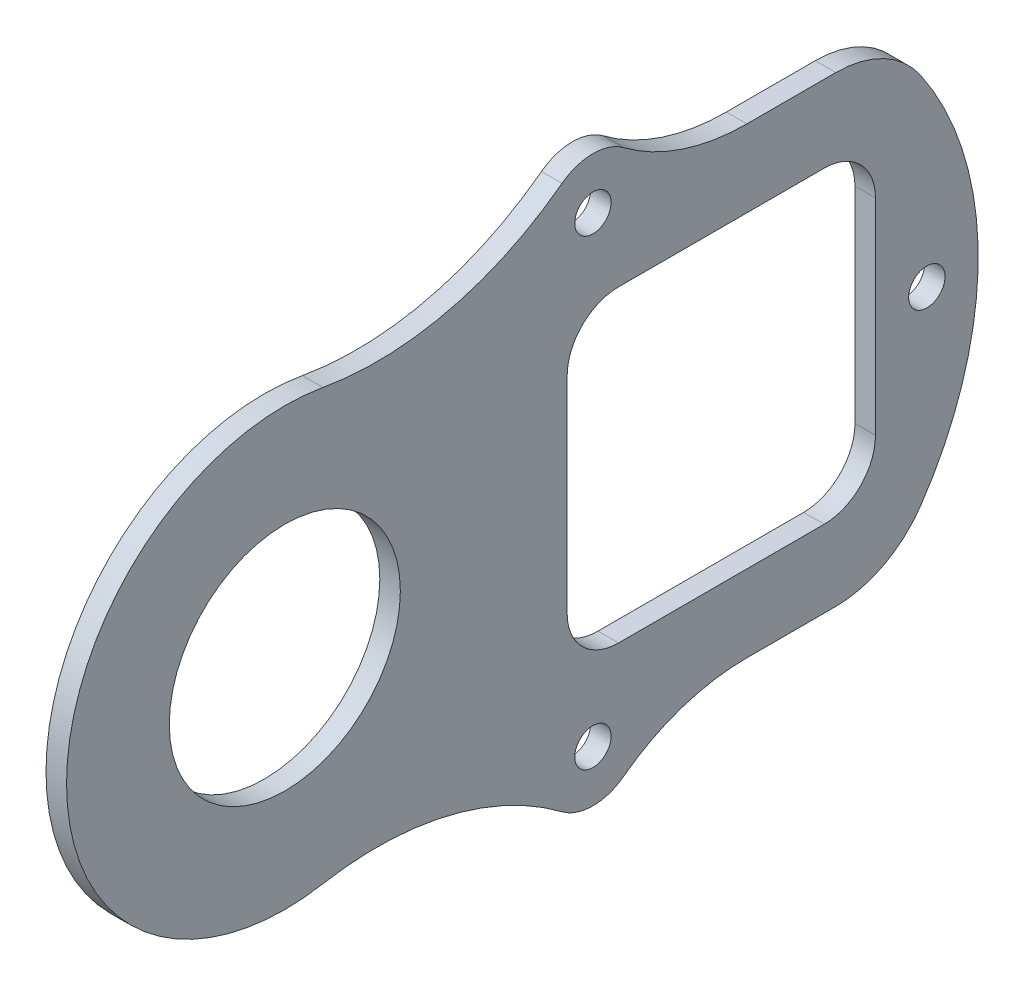
ISO-10303-21;
HEADER;
FILE_DESCRIPTION(('STEP AP214'),'2;1');
FILE_NAME('part.step','',(''),(''),'','','');
FILE_SCHEMA(('AUTOMOTIVE_DESIGN { 1 0 10303 214 1 1 1 1 }'));
ENDSEC;
DATA;
#1=APPLICATION_CONTEXT('core data for automotive mechanical design processes');
#2=APPLICATION_PROTOCOL_DEFINITION('international standard','automotive_design',2000,#1);
#3=PRODUCT_CONTEXT('',#1,'mechanical');
#4=PRODUCT('Part','Part','',(#3));
#5=PRODUCT_RELATED_PRODUCT_CATEGORY('part','',(#4));
#6=PRODUCT_DEFINITION_FORMATION('','',#4);
#7=PRODUCT_DEFINITION_CONTEXT('part definition',#1,'design');
#8=PRODUCT_DEFINITION('design','',#6,#7);
#9=PRODUCT_DEFINITION_SHAPE('','',#8);
#10=(LENGTH_UNIT() NAMED_UNIT(*) SI_UNIT(.MILLI.,.METRE.));
#11=(NAMED_UNIT(*) PLANE_ANGLE_UNIT() SI_UNIT($,.RADIAN.));
#12=(NAMED_UNIT(*) SI_UNIT($,.STERADIAN.) SOLID_ANGLE_UNIT());
#13=UNCERTAINTY_MEASURE_WITH_UNIT(LENGTH_MEASURE(1.E-05),#10,'distance_accuracy_value','');
#14=(GEOMETRIC_REPRESENTATION_CONTEXT(3) GLOBAL_UNCERTAINTY_ASSIGNED_CONTEXT((#13)) GLOBAL_UNIT_ASSIGNED_CONTEXT((#10,
#11,#12)) REPRESENTATION_CONTEXT('',''));
#15=CARTESIAN_POINT('',(0.,0.,0.));
#16=DIRECTION('',(0.,0.,1.));
#17=DIRECTION('',(1.,0.,0.));
#18=AXIS2_PLACEMENT_3D('',#15,#16,#17);
#19=CARTESIAN_POINT('',(2.54,-28.5877,0.));
#20=DIRECTION('',(0.,1.,0.));
#21=DIRECTION('',(0.,0.,1.));
#22=AXIS2_PLACEMENT_3D('',#19,#20,#21);
#23=PLANE('',#22);
#24=DIRECTION('',(0.,0.,-1.));
#25=VECTOR('',#24,1.);
#26=CARTESIAN_POINT('',(0.,-28.5877,0.));
#27=LINE('',#26,#25);
#28=CARTESIAN_POINT('',(0.,-28.5877,-57.1330548969418));
#29=VERTEX_POINT('',#28);
#30=CARTESIAN_POINT('',(0.,-28.5877,-68.1324910234576));
#31=VERTEX_POINT('',#30);
#32=EDGE_CURVE('E239',#29,#31,#27,.T.);
#33=ORIENTED_EDGE('',*,*,#32,.T.);
#34=DIRECTION('',(-1.,0.,0.));
#35=VECTOR('',#34,1.);
#36=CARTESIAN_POINT('',(2.54,-28.5877,-68.1324910234576));
#37=LINE('',#36,#35);
#38=CARTESIAN_POINT('',(2.54,-28.5877,-68.1324910234576));
#39=VERTEX_POINT('',#38);
#40=EDGE_CURVE('E11',#39,#31,#37,.T.);
#41=ORIENTED_EDGE('',*,*,#40,.F.);
#42=DIRECTION('',(0.,0.,-1.));
#43=VECTOR('',#42,1.);
#44=CARTESIAN_POINT('',(2.54,-28.5877,0.));
#45=LINE('',#44,#43);
#46=CARTESIAN_POINT('',(2.54,-28.5877,-57.1330548969418));
#47=VERTEX_POINT('',#46);
#48=EDGE_CURVE('E607',#47,#39,#45,.T.);
#49=ORIENTED_EDGE('',*,*,#48,.F.);
#50=DIRECTION('',(-1.,0.,0.));
#51=VECTOR('',#50,1.);
#52=CARTESIAN_POINT('',(2.54,-28.5877,-57.1330548969418));
#53=LINE('',#52,#51);
#54=EDGE_CURVE('E54',#47,#29,#53,.T.);
#55=ORIENTED_EDGE('',*,*,#54,.T.);
#56=EDGE_LOOP('',(#33,#41,#49,#55));
#57=FACE_BOUND('',#56,.T.);
#58=ADVANCED_FACE('F35',(#57),#23,.F.);
#59=CARTESIAN_POINT('',(2.54,-15.8877,-68.1324910234576));
#60=DIRECTION('',(-1.,0.,0.));
#61=DIRECTION('',(0.,0.,1.));
#62=AXIS2_PLACEMENT_3D('',#59,#60,#61);
#63=CYLINDRICAL_SURFACE('',#62,12.7);
#64=CARTESIAN_POINT('',(0.,-15.8877,-68.1324910234576));
#65=DIRECTION('',(1.,0.,0.));
#66=DIRECTION('',(0.,0.,-1.));
#67=AXIS2_PLACEMENT_3D('',#64,#65,#66);
#68=CIRCLE('',#67,12.7);
#69=CARTESIAN_POINT('',(0.,-23.0472941599217,-78.6220196813724));
#70=VERTEX_POINT('',#69);
#71=EDGE_CURVE('E241',#31,#70,#68,.T.);
#72=ORIENTED_EDGE('',*,*,#71,.T.);
#73=DIRECTION('',(-1.,0.,0.));
#74=VECTOR('',#73,1.);
#75=CARTESIAN_POINT('',(2.54,-23.0472941599217,-78.6220196813724));
#76=LINE('',#75,#74);
#77=CARTESIAN_POINT('',(2.54,-23.0472941599217,-78.6220196813724));
#78=VERTEX_POINT('',#77);
#79=EDGE_CURVE('E45',#78,#70,#76,.T.);
#80=ORIENTED_EDGE('',*,*,#79,.F.);
#81=CARTESIAN_POINT('',(2.54,-15.8877,-68.1324910234576));
#82=DIRECTION('',(1.,0.,0.));
#83=DIRECTION('',(0.,0.,-1.));
#84=AXIS2_PLACEMENT_3D('',#81,#82,#83);
#85=CIRCLE('',#84,12.7);
#86=EDGE_CURVE('E591',#39,#78,#85,.T.);
#87=ORIENTED_EDGE('',*,*,#86,.F.);
#88=ORIENTED_EDGE('',*,*,#40,.T.);
#89=EDGE_LOOP('',(#72,#80,#87,#88));
#90=FACE_BOUND('',#89,.T.);
#91=ADVANCED_FACE('F351',(#90),#63,.T.);
#92=CARTESIAN_POINT('',(2.54,0.,-44.85540565579));
#93=DIRECTION('',(-1.,0.,0.));
#94=DIRECTION('',(0.,0.,1.));
#95=AXIS2_PLACEMENT_3D('',#92,#93,#94);
#96=CYLINDRICAL_SURFACE('',#95,40.88229434421);
#97=CARTESIAN_POINT('',(0.,0.,-44.85540565579));
#98=DIRECTION('',(1.,0.,0.));
#99=DIRECTION('',(0.,0.,-1.));
#100=AXIS2_PLACEMENT_3D('',#97,#98,#99);
#101=CIRCLE('',#100,40.88229434421);
#102=CARTESIAN_POINT('',(0.,23.0472941599217,-78.6220196813724));
#103=VERTEX_POINT('',#102);
#104=EDGE_CURVE('E243',#70,#103,#101,.T.);
#105=ORIENTED_EDGE('',*,*,#104,.T.);
#106=DIRECTION('',(-1.,0.,0.));
#107=VECTOR('',#106,1.);
#108=CARTESIAN_POINT('',(2.54,23.0472941599217,-78.6220196813724));
#109=LINE('',#108,#107);
#110=CARTESIAN_POINT('',(2.54,23.0472941599217,-78.6220196813724));
#111=VERTEX_POINT('',#110);
#112=EDGE_CURVE('E284',#111,#103,#109,.T.);
#113=ORIENTED_EDGE('',*,*,#112,.F.);
#114=CARTESIAN_POINT('',(2.54,0.,-44.85540565579));
#115=DIRECTION('',(1.,0.,0.));
#116=DIRECTION('',(0.,0.,-1.));
#117=AXIS2_PLACEMENT_3D('',#114,#115,#116);
#118=CIRCLE('',#117,40.88229434421);
#119=EDGE_CURVE('E587',#78,#111,#118,.T.);
#120=ORIENTED_EDGE('',*,*,#119,.F.);
#121=ORIENTED_EDGE('',*,*,#79,.T.);
#122=EDGE_LOOP('',(#105,#113,#120,#121));
#123=FACE_BOUND('',#122,.T.);
#124=ADVANCED_FACE('F356',(#123),#96,.T.);
#125=CARTESIAN_POINT('',(2.54,15.8877,-68.1324910234576));
#126=DIRECTION('',(-1.,0.,0.));
#127=DIRECTION('',(0.,0.,1.));
#128=AXIS2_PLACEMENT_3D('',#125,#126,#127);
#129=CYLINDRICAL_SURFACE('',#128,12.7);
#130=CARTESIAN_POINT('',(0.,15.8877,-68.1324910234576));
#131=DIRECTION('',(1.,0.,0.));
#132=DIRECTION('',(0.,0.,-1.));
#133=AXIS2_PLACEMENT_3D('',#130,#131,#132);
#134=CIRCLE('',#133,12.7);
#135=CARTESIAN_POINT('',(0.,28.5877,-68.1324910234576));
#136=VERTEX_POINT('',#135);
#137=EDGE_CURVE('E246',#136,#103,#134,.F.);
#138=ORIENTED_EDGE('',*,*,#137,.F.);
#139=DIRECTION('',(-1.,0.,0.));
#140=VECTOR('',#139,1.);
#141=CARTESIAN_POINT('',(2.54,28.5877,-68.1324910234576));
#142=LINE('',#141,#140);
#143=CARTESIAN_POINT('',(2.54,28.5877,-68.1324910234576));
#144=VERTEX_POINT('',#143);
#145=EDGE_CURVE('E282',#144,#136,#142,.T.);
#146=ORIENTED_EDGE('',*,*,#145,.F.);
#147=CARTESIAN_POINT('',(2.54,15.8877,-68.1324910234576));
#148=DIRECTION('',(1.,0.,0.));
#149=DIRECTION('',(0.,0.,-1.));
#150=AXIS2_PLACEMENT_3D('',#147,#148,#149);
#151=CIRCLE('',#150,12.7);
#152=EDGE_CURVE('E583',#144,#111,#151,.F.);
#153=ORIENTED_EDGE('',*,*,#152,.T.);
#154=ORIENTED_EDGE('',*,*,#112,.T.);
#155=EDGE_LOOP('',(#138,#146,#153,#154));
#156=FACE_BOUND('',#155,.T.);
#157=ADVANCED_FACE('F536',(#156),#129,.T.);
#158=CARTESIAN_POINT('',(2.54,28.5877,0.));
#159=DIRECTION('',(0.,1.,0.));
#160=DIRECTION('',(0.,0.,1.));
#161=AXIS2_PLACEMENT_3D('',#158,#159,#160);
#162=PLANE('',#161);
#163=DIRECTION('',(0.,0.,-1.));
#164=VECTOR('',#163,1.);
#165=CARTESIAN_POINT('',(0.,28.5877,0.));
#166=LINE('',#165,#164);
#167=CARTESIAN_POINT('',(0.,28.5877,-57.1330548969418));
#168=VERTEX_POINT('',#167);
#169=EDGE_CURVE('E249',#168,#136,#166,.T.);
#170=ORIENTED_EDGE('',*,*,#169,.F.);
#171=DIRECTION('',(-1.,0.,0.));
#172=VECTOR('',#171,1.);
#173=CARTESIAN_POINT('',(2.54,28.5877,-57.1330548969418));
#174=LINE('',#173,#172);
#175=CARTESIAN_POINT('',(2.54,28.5877,-57.1330548969418));
#176=VERTEX_POINT('',#175);
#177=EDGE_CURVE('E280',#176,#168,#174,.T.);
#178=ORIENTED_EDGE('',*,*,#177,.F.);
#179=DIRECTION('',(0.,0.,-1.));
#180=VECTOR('',#179,1.);
#181=CARTESIAN_POINT('',(2.54,28.5877,0.));
#182=LINE('',#181,#180);
#183=EDGE_CURVE('E586',#176,#144,#182,.T.);
#184=ORIENTED_EDGE('',*,*,#183,.T.);
#185=ORIENTED_EDGE('',*,*,#145,.T.);
#186=EDGE_LOOP('',(#170,#178,#184,#185));
#187=FACE_BOUND('',#186,.T.);
#188=ADVANCED_FACE('F527',(#187),#162,.T.);
#189=CARTESIAN_POINT('',(2.54,53.9877,-57.1330548969418));
#190=DIRECTION('',(-1.,0.,0.));
#191=DIRECTION('',(0.,0.,1.));
#192=AXIS2_PLACEMENT_3D('',#189,#190,#191);
#193=CYLINDRICAL_SURFACE('',#192,25.4);
#194=CARTESIAN_POINT('',(0.,53.9877,-57.1330548969418));
#195=DIRECTION('',(1.,0.,0.));
#196=DIRECTION('',(0.,0.,-1.));
#197=AXIS2_PLACEMENT_3D('',#194,#195,#196);
#198=CIRCLE('',#197,25.4);
#199=CARTESIAN_POINT('',(0.,33.65754,-41.9066109793884));
#200=VERTEX_POINT('',#199);
#201=EDGE_CURVE('E252',#200,#168,#198,.T.);
#202=ORIENTED_EDGE('',*,*,#201,.F.);
#203=DIRECTION('',(-1.,0.,0.));
#204=VECTOR('',#203,1.);
#205=CARTESIAN_POINT('',(2.54,33.65754,-41.9066109793884));
#206=LINE('',#205,#204);
#207=CARTESIAN_POINT('',(2.54,33.65754,-41.9066109793884));
#208=VERTEX_POINT('',#207);
#209=EDGE_CURVE('E278',#208,#200,#206,.T.);
#210=ORIENTED_EDGE('',*,*,#209,.F.);
#211=CARTESIAN_POINT('',(2.54,53.9877,-57.1330548969418));
#212=DIRECTION('',(1.,0.,0.));
#213=DIRECTION('',(0.,0.,-1.));
#214=AXIS2_PLACEMENT_3D('',#211,#212,#213);
#215=CIRCLE('',#214,25.4);
#216=EDGE_CURVE('E589',#208,#176,#215,.T.);
#217=ORIENTED_EDGE('',*,*,#216,.T.);
#218=ORIENTED_EDGE('',*,*,#177,.T.);
#219=EDGE_LOOP('',(#202,#210,#217,#218));
#220=FACE_BOUND('',#219,.T.);
#221=ADVANCED_FACE('F518',(#220),#193,.F.);
#222=CARTESIAN_POINT('',(2.54,28.575,-38.1));
#223=DIRECTION('',(-1.,0.,0.));
#224=DIRECTION('',(0.,0.,1.));
#225=AXIS2_PLACEMENT_3D('',#222,#223,#224);
#226=CYLINDRICAL_SURFACE('',#225,6.35);
#227=CARTESIAN_POINT('',(0.,28.575,-38.1));
#228=DIRECTION('',(1.,0.,0.));
#229=DIRECTION('',(0.,0.,-1.));
#230=AXIS2_PLACEMENT_3D('',#227,#228,#229);
#231=CIRCLE('',#230,6.35);
#232=CARTESIAN_POINT('',(0.,33.6481883290752,-34.2809346460508));
#233=VERTEX_POINT('',#232);
#234=EDGE_CURVE('E255',#200,#233,#231,.T.);
#235=ORIENTED_EDGE('',*,*,#234,.T.);
#236=DIRECTION('',(-1.,0.,0.));
#237=VECTOR('',#236,1.);
#238=CARTESIAN_POINT('',(2.54,33.6481883290752,-34.2809346460508));
#239=LINE('',#238,#237);
#240=CARTESIAN_POINT('',(2.54,33.6481883290752,-34.2809346460508));
#241=VERTEX_POINT('',#240);
#242=EDGE_CURVE('E276',#241,#233,#239,.T.);
#243=ORIENTED_EDGE('',*,*,#242,.F.);
#244=CARTESIAN_POINT('',(2.54,28.575,-38.1));
#245=DIRECTION('',(1.,0.,0.));
#246=DIRECTION('',(0.,0.,-1.));
#247=AXIS2_PLACEMENT_3D('',#244,#245,#246);
#248=CIRCLE('',#247,6.35);
#249=EDGE_CURVE('E597',#208,#241,#248,.T.);
#250=ORIENTED_EDGE('',*,*,#249,.F.);
#251=ORIENTED_EDGE('',*,*,#209,.T.);
#252=EDGE_LOOP('',(#235,#243,#250,#251));
#253=FACE_BOUND('',#252,.T.);
#254=ADVANCED_FACE('F509',(#253),#226,.T.);
#255=CARTESIAN_POINT('',(2.54,64.0873183035265,-11.3665425223556));
#256=DIRECTION('',(-1.,0.,0.));
#257=DIRECTION('',(0.,0.,1.));
#258=AXIS2_PLACEMENT_3D('',#255,#256,#257);
#259=CYLINDRICAL_SURFACE('',#258,38.1);
#260=CARTESIAN_POINT('',(0.,64.0873183035265,-11.3665425223556));
#261=DIRECTION('',(1.,0.,0.));
#262=DIRECTION('',(0.,0.,-1.));
#263=AXIS2_PLACEMENT_3D('',#260,#261,#262);
#264=CIRCLE('',#263,38.1);
#265=CARTESIAN_POINT('',(0.,26.5727905160965,-4.71295665561091));
#266=VERTEX_POINT('',#265);
#267=EDGE_CURVE('E258',#266,#233,#264,.T.);
#268=ORIENTED_EDGE('',*,*,#267,.F.);
#269=DIRECTION('',(-1.,0.,0.));
#270=VECTOR('',#269,1.);
#271=CARTESIAN_POINT('',(2.54,26.5727905160965,-4.71295665561091));
#272=LINE('',#271,#270);
#273=CARTESIAN_POINT('',(2.54,26.5727905160965,-4.71295665561091));
#274=VERTEX_POINT('',#273);
#275=EDGE_CURVE('E274',#274,#266,#272,.T.);
#276=ORIENTED_EDGE('',*,*,#275,.F.);
#277=CARTESIAN_POINT('',(2.54,64.0873183035265,-11.3665425223556));
#278=DIRECTION('',(1.,0.,0.));
#279=DIRECTION('',(0.,0.,-1.));
#280=AXIS2_PLACEMENT_3D('',#277,#278,#279);
#281=CIRCLE('',#280,38.1);
#282=EDGE_CURVE('E205',#274,#241,#281,.T.);
#283=ORIENTED_EDGE('',*,*,#282,.T.);
#284=ORIENTED_EDGE('',*,*,#242,.T.);
#285=EDGE_LOOP('',(#268,#276,#283,#284));
#286=FACE_BOUND('',#285,.T.);
#287=ADVANCED_FACE('F500',(#286),#259,.F.);
#288=CARTESIAN_POINT('',(2.54,0.,0.));
#289=DIRECTION('',(-1.,0.,0.));
#290=DIRECTION('',(0.,0.,1.));
#291=AXIS2_PLACEMENT_3D('',#288,#289,#290);
#292=CYLINDRICAL_SURFACE('',#291,26.9875000000003);
#293=CARTESIAN_POINT('',(0.,0.,0.));
#294=DIRECTION('',(1.,0.,0.));
#295=DIRECTION('',(0.,0.,-1.));
#296=AXIS2_PLACEMENT_3D('',#293,#294,#295);
#297=CIRCLE('',#296,26.9875000000003);
#298=CARTESIAN_POINT('',(0.,-26.5727905160965,-4.71295665561091));
#299=VERTEX_POINT('',#298);
#300=EDGE_CURVE('E261',#266,#299,#297,.T.);
#301=ORIENTED_EDGE('',*,*,#300,.T.);
#302=DIRECTION('',(-1.,0.,0.));
#303=VECTOR('',#302,1.);
#304=CARTESIAN_POINT('',(2.54,-26.5727905160965,-4.71295665561091));
#305=LINE('',#304,#303);
#306=CARTESIAN_POINT('',(2.54,-26.5727905160965,-4.71295665561091));
#307=VERTEX_POINT('',#306);
#308=EDGE_CURVE('E190',#307,#299,#305,.T.);
#309=ORIENTED_EDGE('',*,*,#308,.F.);
#310=CARTESIAN_POINT('',(2.54,0.,0.));
#311=DIRECTION('',(1.,0.,0.));
#312=DIRECTION('',(0.,0.,-1.));
#313=AXIS2_PLACEMENT_3D('',#310,#311,#312);
#314=CIRCLE('',#313,26.9875000000003);
#315=EDGE_CURVE('E202',#274,#307,#314,.T.);
#316=ORIENTED_EDGE('',*,*,#315,.F.);
#317=ORIENTED_EDGE('',*,*,#275,.T.);
#318=EDGE_LOOP('',(#301,#309,#316,#317));
#319=FACE_BOUND('',#318,.T.);
#320=ADVANCED_FACE('F492',(#319),#292,.T.);
#321=CARTESIAN_POINT('',(2.54,-64.0873183035265,-11.3665425223556));
#322=DIRECTION('',(-1.,0.,0.));
#323=DIRECTION('',(0.,0.,1.));
#324=AXIS2_PLACEMENT_3D('',#321,#322,#323);
#325=CYLINDRICAL_SURFACE('',#324,38.1);
#326=CARTESIAN_POINT('',(0.,-64.0873183035265,-11.3665425223556));
#327=DIRECTION('',(1.,0.,0.));
#328=DIRECTION('',(0.,0.,-1.));
#329=AXIS2_PLACEMENT_3D('',#326,#327,#328);
#330=CIRCLE('',#329,38.1);
#331=CARTESIAN_POINT('',(0.,-33.6481883290752,-34.2809346460508));
#332=VERTEX_POINT('',#331);
#333=EDGE_CURVE('E187',#332,#299,#330,.T.);
#334=ORIENTED_EDGE('',*,*,#333,.F.);
#335=DIRECTION('',(-1.,0.,0.));
#336=VECTOR('',#335,1.);
#337=CARTESIAN_POINT('',(2.54,-33.6481883290752,-34.2809346460508));
#338=LINE('',#337,#336);
#339=CARTESIAN_POINT('',(2.54,-33.6481883290752,-34.2809346460508));
#340=VERTEX_POINT('',#339);
#341=EDGE_CURVE('E181',#340,#332,#338,.T.);
#342=ORIENTED_EDGE('',*,*,#341,.F.);
#343=CARTESIAN_POINT('',(2.54,-64.0873183035265,-11.3665425223556));
#344=DIRECTION('',(1.,0.,0.));
#345=DIRECTION('',(0.,0.,-1.));
#346=AXIS2_PLACEMENT_3D('',#343,#344,#345);
#347=CIRCLE('',#346,38.1);
#348=EDGE_CURVE('E185',#340,#307,#347,.T.);
#349=ORIENTED_EDGE('',*,*,#348,.T.);
#350=ORIENTED_EDGE('',*,*,#308,.T.);
#351=EDGE_LOOP('',(#334,#342,#349,#350));
#352=FACE_BOUND('',#351,.T.);
#353=ADVANCED_FACE('F183',(#352),#325,.F.);
#354=CARTESIAN_POINT('',(2.54,-28.575,-38.1));
#355=DIRECTION('',(-1.,0.,0.));
#356=DIRECTION('',(0.,0.,1.));
#357=AXIS2_PLACEMENT_3D('',#354,#355,#356);
#358=CYLINDRICAL_SURFACE('',#357,6.35);
#359=CARTESIAN_POINT('',(0.,-28.575,-38.1));
#360=DIRECTION('',(1.,0.,0.));
#361=DIRECTION('',(0.,0.,-1.));
#362=AXIS2_PLACEMENT_3D('',#359,#360,#361);
#363=CIRCLE('',#362,6.35);
#364=CARTESIAN_POINT('',(0.,-33.65754,-41.9066109793884));
#365=VERTEX_POINT('',#364);
#366=EDGE_CURVE('E265',#332,#365,#363,.T.);
#367=ORIENTED_EDGE('',*,*,#366,.T.);
#368=DIRECTION('',(-1.,0.,0.));
#369=VECTOR('',#368,1.);
#370=CARTESIAN_POINT('',(2.54,-33.65754,-41.9066109793884));
#371=LINE('',#370,#369);
#372=CARTESIAN_POINT('',(2.54,-33.65754,-41.9066109793884));
#373=VERTEX_POINT('',#372);
#374=EDGE_CURVE('E117',#373,#365,#371,.T.);
#375=ORIENTED_EDGE('',*,*,#374,.F.);
#376=CARTESIAN_POINT('',(2.54,-28.575,-38.1));
#377=DIRECTION('',(1.,0.,0.));
#378=DIRECTION('',(0.,0.,-1.));
#379=AXIS2_PLACEMENT_3D('',#376,#377,#378);
#380=CIRCLE('',#379,6.35);
#381=EDGE_CURVE('E192',#340,#373,#380,.T.);
#382=ORIENTED_EDGE('',*,*,#381,.F.);
#383=ORIENTED_EDGE('',*,*,#341,.T.);
#384=EDGE_LOOP('',(#367,#375,#382,#383));
#385=FACE_BOUND('',#384,.T.);
#386=ADVANCED_FACE('F193',(#385),#358,.T.);
#387=CARTESIAN_POINT('',(2.54,12.7127,-41.2622999999999));
#388=DIRECTION('',(-1.,0.,0.));
#389=DIRECTION('',(0.,0.,1.));
#390=AXIS2_PLACEMENT_3D('',#387,#388,#389);
#391=CYLINDRICAL_SURFACE('',#390,6.35);
#392=CARTESIAN_POINT('',(0.,12.7127,-41.2622999999999));
#393=DIRECTION('',(1.,0.,0.));
#394=DIRECTION('',(0.,0.,-1.));
#395=AXIS2_PLACEMENT_3D('',#392,#393,#394);
#396=CIRCLE('',#395,6.35);
#397=CARTESIAN_POINT('',(0.,19.0627,-41.2622999999999));
#398=VERTEX_POINT('',#397);
#399=CARTESIAN_POINT('',(0.,12.7127,-34.9122999999999));
#400=VERTEX_POINT('',#399);
#401=EDGE_CURVE('E214',#398,#400,#396,.T.);
#402=ORIENTED_EDGE('',*,*,#401,.F.);
#403=DIRECTION('',(-1.,0.,0.));
#404=VECTOR('',#403,1.);
#405=CARTESIAN_POINT('',(2.54,19.0627,-41.2622999999999));
#406=LINE('',#405,#404);
#407=CARTESIAN_POINT('',(2.54,19.0627,-41.2622999999999));
#408=VERTEX_POINT('',#407);
#409=EDGE_CURVE('E39',#408,#398,#406,.T.);
#410=ORIENTED_EDGE('',*,*,#409,.F.);
#411=CARTESIAN_POINT('',(2.54,12.7127,-41.2622999999999));
#412=DIRECTION('',(1.,0.,0.));
#413=DIRECTION('',(0.,0.,-1.));
#414=AXIS2_PLACEMENT_3D('',#411,#412,#413);
#415=CIRCLE('',#414,6.35);
#416=CARTESIAN_POINT('',(2.54,12.7127,-34.9122999999999));
#417=VERTEX_POINT('',#416);
#418=EDGE_CURVE('E315',#408,#417,#415,.T.);
#419=ORIENTED_EDGE('',*,*,#418,.T.);
#420=DIRECTION('',(-1.,0.,0.));
#421=VECTOR('',#420,1.);
#422=CARTESIAN_POINT('',(2.54,12.7127,-34.9122999999999));
#423=LINE('',#422,#421);
#424=EDGE_CURVE('E210',#417,#400,#423,.T.);
#425=ORIENTED_EDGE('',*,*,#424,.T.);
#426=EDGE_LOOP('',(#402,#410,#419,#425));
#427=FACE_BOUND('',#426,.T.);
#428=ADVANCED_FACE('F314',(#427),#391,.F.);
#429=CARTESIAN_POINT('',(2.54,19.0627,0.));
#430=DIRECTION('',(0.,1.,0.));
#431=DIRECTION('',(0.,0.,1.));
#432=AXIS2_PLACEMENT_3D('',#429,#430,#431);
#433=PLANE('',#432);
#434=DIRECTION('',(0.,0.,-1.));
#435=VECTOR('',#434,1.);
#436=CARTESIAN_POINT('',(0.,19.0627,0.));
#437=LINE('',#436,#435);
#438=CARTESIAN_POINT('',(0.,19.0627,-66.6876999999999));
#439=VERTEX_POINT('',#438);
#440=EDGE_CURVE('E218',#398,#439,#437,.T.);
#441=ORIENTED_EDGE('',*,*,#440,.T.);
#442=DIRECTION('',(-1.,0.,0.));
#443=VECTOR('',#442,1.);
#444=CARTESIAN_POINT('',(2.54,19.0627,-66.6876999999999));
#445=LINE('',#444,#443);
#446=CARTESIAN_POINT('',(2.54,19.0627,-66.6876999999999));
#447=VERTEX_POINT('',#446);
#448=EDGE_CURVE('E300',#447,#439,#445,.T.);
#449=ORIENTED_EDGE('',*,*,#448,.F.);
#450=DIRECTION('',(0.,0.,-1.));
#451=VECTOR('',#450,1.);
#452=CARTESIAN_POINT('',(2.54,19.0627,0.));
#453=LINE('',#452,#451);
#454=EDGE_CURVE('E308',#408,#447,#453,.T.);
#455=ORIENTED_EDGE('',*,*,#454,.F.);
#456=ORIENTED_EDGE('',*,*,#409,.T.);
#457=EDGE_LOOP('',(#441,#449,#455,#456));
#458=FACE_BOUND('',#457,.T.);
#459=ADVANCED_FACE('F306',(#458),#433,.F.);
#460=CARTESIAN_POINT('',(2.54,12.7127,-66.6876999999999));
#461=DIRECTION('',(-1.,0.,0.));
#462=DIRECTION('',(0.,0.,1.));
#463=AXIS2_PLACEMENT_3D('',#460,#461,#462);
#464=CYLINDRICAL_SURFACE('',#463,6.35);
#465=CARTESIAN_POINT('',(0.,12.7127,-66.6876999999999));
#466=DIRECTION('',(1.,0.,0.));
#467=DIRECTION('',(0.,0.,-1.));
#468=AXIS2_PLACEMENT_3D('',#465,#466,#467);
#469=CIRCLE('',#468,6.35);
#470=CARTESIAN_POINT('',(0.,12.7127,-73.0376999999999));
#471=VERTEX_POINT('',#470);
#472=EDGE_CURVE('E221',#439,#471,#469,.F.);
#473=ORIENTED_EDGE('',*,*,#472,.T.);
#474=DIRECTION('',(-1.,0.,0.));
#475=VECTOR('',#474,1.);
#476=CARTESIAN_POINT('',(2.54,12.7127,-73.0376999999999));
#477=LINE('',#476,#475);
#478=CARTESIAN_POINT('',(2.54,12.7127,-73.0376999999999));
#479=VERTEX_POINT('',#478);
#480=EDGE_CURVE('E298',#479,#471,#477,.T.);
#481=ORIENTED_EDGE('',*,*,#480,.F.);
#482=CARTESIAN_POINT('',(2.54,12.7127,-66.6876999999999));
#483=DIRECTION('',(1.,0.,0.));
#484=DIRECTION('',(0.,0.,-1.));
#485=AXIS2_PLACEMENT_3D('',#482,#483,#484);
#486=CIRCLE('',#485,6.35);
#487=EDGE_CURVE('E617',#447,#479,#486,.F.);
#488=ORIENTED_EDGE('',*,*,#487,.F.);
#489=ORIENTED_EDGE('',*,*,#448,.T.);
#490=EDGE_LOOP('',(#473,#481,#488,#489));
#491=FACE_BOUND('',#490,.T.);
#492=ADVANCED_FACE('F341',(#491),#464,.F.);
#493=CARTESIAN_POINT('',(2.54,0.,-73.0376999999999));
#494=DIRECTION('',(0.,0.,-1.));
#495=DIRECTION('',(-1.,0.,0.));
#496=AXIS2_PLACEMENT_3D('',#493,#494,#495);
#497=PLANE('',#496);
#498=DIRECTION('',(0.,-1.,0.));
#499=VECTOR('',#498,1.);
#500=CARTESIAN_POINT('',(0.,0.,-73.0376999999999));
#501=LINE('',#500,#499);
#502=CARTESIAN_POINT('',(0.,-12.7127,-73.0376999999999));
#503=VERTEX_POINT('',#502);
#504=EDGE_CURVE('E224',#471,#503,#501,.T.);
#505=ORIENTED_EDGE('',*,*,#504,.T.);
#506=DIRECTION('',(-1.,0.,0.));
#507=VECTOR('',#506,1.);
#508=CARTESIAN_POINT('',(2.54,-12.7127,-73.0376999999999));
#509=LINE('',#508,#507);
#510=CARTESIAN_POINT('',(2.54,-12.7127,-73.0376999999999));
#511=VERTEX_POINT('',#510);
#512=EDGE_CURVE('E295',#511,#503,#509,.T.);
#513=ORIENTED_EDGE('',*,*,#512,.F.);
#514=DIRECTION('',(0.,-1.,0.));
#515=VECTOR('',#514,1.);
#516=CARTESIAN_POINT('',(2.54,0.,-73.0376999999999));
#517=LINE('',#516,#515);
#518=EDGE_CURVE('E339',#479,#511,#517,.T.);
#519=ORIENTED_EDGE('',*,*,#518,.F.);
#520=ORIENTED_EDGE('',*,*,#480,.T.);
#521=EDGE_LOOP('',(#505,#513,#519,#520));
#522=FACE_BOUND('',#521,.T.);
#523=ADVANCED_FACE('F337',(#522),#497,.F.);
#524=CARTESIAN_POINT('',(2.54,-12.7127,-66.6876999999999));
#525=DIRECTION('',(-1.,0.,0.));
#526=DIRECTION('',(0.,0.,1.));
#527=AXIS2_PLACEMENT_3D('',#524,#525,#526);
#528=CYLINDRICAL_SURFACE('',#527,6.35);
#529=CARTESIAN_POINT('',(0.,-12.7127,-66.6876999999999));
#530=DIRECTION('',(1.,0.,0.));
#531=DIRECTION('',(0.,0.,-1.));
#532=AXIS2_PLACEMENT_3D('',#529,#530,#531);
#533=CIRCLE('',#532,6.35);
#534=CARTESIAN_POINT('',(0.,-19.0627,-66.6876999999999));
#535=VERTEX_POINT('',#534);
#536=EDGE_CURVE('E227',#503,#535,#533,.F.);
#537=ORIENTED_EDGE('',*,*,#536,.T.);
#538=DIRECTION('',(-1.,0.,0.));
#539=VECTOR('',#538,1.);
#540=CARTESIAN_POINT('',(2.54,-19.0627,-66.6876999999999));
#541=LINE('',#540,#539);
#542=CARTESIAN_POINT('',(2.54,-19.0627,-66.6876999999999));
#543=VERTEX_POINT('',#542);
#544=EDGE_CURVE('E293',#543,#535,#541,.T.);
#545=ORIENTED_EDGE('',*,*,#544,.F.);
#546=CARTESIAN_POINT('',(2.54,-12.7127,-66.6876999999999));
#547=DIRECTION('',(1.,0.,0.));
#548=DIRECTION('',(0.,0.,-1.));
#549=AXIS2_PLACEMENT_3D('',#546,#547,#548);
#550=CIRCLE('',#549,6.35);
#551=EDGE_CURVE('E614',#511,#543,#550,.F.);
#552=ORIENTED_EDGE('',*,*,#551,.F.);
#553=ORIENTED_EDGE('',*,*,#512,.T.);
#554=EDGE_LOOP('',(#537,#545,#552,#553));
#555=FACE_BOUND('',#554,.T.);
#556=ADVANCED_FACE('F333',(#555),#528,.F.);
#557=CARTESIAN_POINT('',(2.54,-19.0627,0.));
#558=DIRECTION('',(0.,1.,0.));
#559=DIRECTION('',(0.,0.,1.));
#560=AXIS2_PLACEMENT_3D('',#557,#558,#559);
#561=PLANE('',#560);
#562=DIRECTION('',(0.,0.,-1.));
#563=VECTOR('',#562,1.);
#564=CARTESIAN_POINT('',(0.,-19.0627,0.));
#565=LINE('',#564,#563);
#566=CARTESIAN_POINT('',(0.,-19.0627,-41.2622999999999));
#567=VERTEX_POINT('',#566);
#568=EDGE_CURVE('E230',#567,#535,#565,.T.);
#569=ORIENTED_EDGE('',*,*,#568,.F.);
#570=DIRECTION('',(-1.,0.,0.));
#571=VECTOR('',#570,1.);
#572=CARTESIAN_POINT('',(2.54,-19.0627,-41.2622999999999));
#573=LINE('',#572,#571);
#574=CARTESIAN_POINT('',(2.54,-19.0627,-41.2622999999999));
#575=VERTEX_POINT('',#574);
#576=EDGE_CURVE('E291',#575,#567,#573,.T.);
#577=ORIENTED_EDGE('',*,*,#576,.F.);
#578=DIRECTION('',(0.,0.,-1.));
#579=VECTOR('',#578,1.);
#580=CARTESIAN_POINT('',(2.54,-19.0627,0.));
#581=LINE('',#580,#579);
#582=EDGE_CURVE('E331',#575,#543,#581,.T.);
#583=ORIENTED_EDGE('',*,*,#582,.T.);
#584=ORIENTED_EDGE('',*,*,#544,.T.);
#585=EDGE_LOOP('',(#569,#577,#583,#584));
#586=FACE_BOUND('',#585,.T.);
#587=ADVANCED_FACE('F326',(#586),#561,.T.);
#588=CARTESIAN_POINT('',(2.54,-12.7127,-41.2622999999999));
#589=DIRECTION('',(-1.,0.,0.));
#590=DIRECTION('',(0.,0.,1.));
#591=AXIS2_PLACEMENT_3D('',#588,#589,#590);
#592=CYLINDRICAL_SURFACE('',#591,6.35);
#593=CARTESIAN_POINT('',(0.,-12.7127,-41.2622999999999));
#594=DIRECTION('',(1.,0.,0.));
#595=DIRECTION('',(0.,0.,-1.));
#596=AXIS2_PLACEMENT_3D('',#593,#594,#595);
#597=CIRCLE('',#596,6.35);
#598=CARTESIAN_POINT('',(0.,-12.7127,-34.9122999999999));
#599=VERTEX_POINT('',#598);
#600=EDGE_CURVE('E233',#567,#599,#597,.F.);
#601=ORIENTED_EDGE('',*,*,#600,.T.);
#602=DIRECTION('',(-1.,0.,0.));
#603=VECTOR('',#602,1.);
#604=CARTESIAN_POINT('',(2.54,-12.7127,-34.9122999999999));
#605=LINE('',#604,#603);
#606=CARTESIAN_POINT('',(2.54,-12.7127,-34.9122999999999));
#607=VERTEX_POINT('',#606);
#608=EDGE_CURVE('E289',#607,#599,#605,.T.);
#609=ORIENTED_EDGE('',*,*,#608,.F.);
#610=CARTESIAN_POINT('',(2.54,-12.7127,-41.2622999999999));
#611=DIRECTION('',(1.,0.,0.));
#612=DIRECTION('',(0.,0.,-1.));
#613=AXIS2_PLACEMENT_3D('',#610,#611,#612);
#614=CIRCLE('',#613,6.35);
#615=EDGE_CURVE('E609',#575,#607,#614,.F.);
#616=ORIENTED_EDGE('',*,*,#615,.F.);
#617=ORIENTED_EDGE('',*,*,#576,.T.);
#618=EDGE_LOOP('',(#601,#609,#616,#617));
#619=FACE_BOUND('',#618,.T.);
#620=ADVANCED_FACE('F363',(#619),#592,.F.);
#621=CARTESIAN_POINT('',(2.54,0.,-34.9122999999999));
#622=DIRECTION('',(0.,0.,-1.));
#623=DIRECTION('',(-1.,0.,0.));
#624=AXIS2_PLACEMENT_3D('',#621,#622,#623);
#625=PLANE('',#624);
#626=DIRECTION('',(0.,-1.,0.));
#627=VECTOR('',#626,1.);
#628=CARTESIAN_POINT('',(0.,0.,-34.9122999999999));
#629=LINE('',#628,#627);
#630=EDGE_CURVE('E236',#400,#599,#629,.T.);
#631=ORIENTED_EDGE('',*,*,#630,.F.);
#632=ORIENTED_EDGE('',*,*,#424,.F.);
#633=DIRECTION('',(0.,-1.,0.));
#634=VECTOR('',#633,1.);
#635=CARTESIAN_POINT('',(2.54,0.,-34.9122999999999));
#636=LINE('',#635,#634);
#637=EDGE_CURVE('E320',#417,#607,#636,.T.);
#638=ORIENTED_EDGE('',*,*,#637,.T.);
#639=ORIENTED_EDGE('',*,*,#608,.T.);
#640=EDGE_LOOP('',(#631,#632,#638,#639));
#641=FACE_BOUND('',#640,.T.);
#642=ADVANCED_FACE('F319',(#641),#625,.T.);
#643=CARTESIAN_POINT('',(2.54,0.,0.));
#644=DIRECTION('',(-1.,0.,0.));
#645=DIRECTION('',(0.,0.,1.));
#646=AXIS2_PLACEMENT_3D('',#643,#644,#645);
#647=CYLINDRICAL_SURFACE('',#646,14.2875);
#648=CARTESIAN_POINT('',(2.54,0.,0.));
#649=DIRECTION('',(1.,0.,0.));
#650=DIRECTION('',(0.,0.,-1.));
#651=AXIS2_PLACEMENT_3D('',#648,#649,#650);
#652=CIRCLE('',#651,14.2875);
#653=CARTESIAN_POINT('',(2.54,0.,-14.2875));
#654=VERTEX_POINT('',#653);
#655=EDGE_CURVE('E270',#654,#654,#652,.T.);
#656=ORIENTED_EDGE('',*,*,#655,.T.);
#657=EDGE_LOOP('',(#656));
#658=FACE_BOUND('',#657,.T.);
#659=CARTESIAN_POINT('',(0.,0.,0.));
#660=DIRECTION('',(1.,0.,0.));
#661=DIRECTION('',(0.,0.,-1.));
#662=AXIS2_PLACEMENT_3D('',#659,#660,#661);
#663=CIRCLE('',#662,14.2875);
#664=CARTESIAN_POINT('',(0.,0.,-14.2875));
#665=VERTEX_POINT('',#664);
#666=EDGE_CURVE('E211',#665,#665,#663,.T.);
#667=ORIENTED_EDGE('',*,*,#666,.F.);
#668=EDGE_LOOP('',(#667));
#669=FACE_BOUND('',#668,.T.);
#670=ADVANCED_FACE('F37',(#658,#669),#647,.F.);
#671=CARTESIAN_POINT('',(2.54,-53.9877,-57.1330548969418));
#672=DIRECTION('',(-1.,0.,0.));
#673=DIRECTION('',(0.,0.,1.));
#674=AXIS2_PLACEMENT_3D('',#671,#672,#673);
#675=CYLINDRICAL_SURFACE('',#674,25.4);
#676=CARTESIAN_POINT('',(0.,-53.9877,-57.1330548969418));
#677=DIRECTION('',(1.,0.,0.));
#678=DIRECTION('',(0.,0.,-1.));
#679=AXIS2_PLACEMENT_3D('',#676,#677,#678);
#680=CIRCLE('',#679,25.4);
#681=EDGE_CURVE('E267',#29,#365,#680,.T.);
#682=ORIENTED_EDGE('',*,*,#681,.F.);
#683=ORIENTED_EDGE('',*,*,#54,.F.);
#684=CARTESIAN_POINT('',(2.54,-53.9877,-57.1330548969418));
#685=DIRECTION('',(1.,0.,0.));
#686=DIRECTION('',(0.,0.,-1.));
#687=AXIS2_PLACEMENT_3D('',#684,#685,#686);
#688=CIRCLE('',#687,25.4);
#689=EDGE_CURVE('E196',#47,#373,#688,.T.);
#690=ORIENTED_EDGE('',*,*,#689,.T.);
#691=ORIENTED_EDGE('',*,*,#374,.T.);
#692=EDGE_LOOP('',(#682,#683,#690,#691));
#693=FACE_BOUND('',#692,.T.);
#694=ADVANCED_FACE('F391',(#693),#675,.F.);
#695=CARTESIAN_POINT('',(2.54,0.,0.));
#696=DIRECTION('',(1.,0.,0.));
#697=DIRECTION('',(0.,0.,-1.));
#698=AXIS2_PLACEMENT_3D('',#695,#696,#697);
#699=PLANE('',#698);
#700=CARTESIAN_POINT('',(2.54,28.575,-38.1));
#701=DIRECTION('',(1.,0.,0.));
#702=DIRECTION('',(0.,0.,-1.));
#703=AXIS2_PLACEMENT_3D('',#700,#701,#702);
#704=CIRCLE('',#703,2.2479);
#705=CARTESIAN_POINT('',(2.54,28.575,-40.3479));
#706=VERTEX_POINT('',#705);
#707=EDGE_CURVE('E637',#706,#706,#704,.T.);
#708=ORIENTED_EDGE('',*,*,#707,.F.);
#709=EDGE_LOOP('',(#708));
#710=FACE_BOUND('',#709,.T.);
#711=CARTESIAN_POINT('',(2.54,0.,-79.3876999999999));
#712=DIRECTION('',(1.,0.,0.));
#713=DIRECTION('',(0.,0.,-1.));
#714=AXIS2_PLACEMENT_3D('',#711,#712,#713);
#715=CIRCLE('',#714,2.2479);
#716=CARTESIAN_POINT('',(2.54,0.,-81.6355999999999));
#717=VERTEX_POINT('',#716);
#718=EDGE_CURVE('E631',#717,#717,#715,.T.);
#719=ORIENTED_EDGE('',*,*,#718,.F.);
#720=EDGE_LOOP('',(#719));
#721=FACE_BOUND('',#720,.T.);
#722=CARTESIAN_POINT('',(2.54,-28.575,-38.1));
#723=DIRECTION('',(1.,0.,0.));
#724=DIRECTION('',(0.,0.,-1.));
#725=AXIS2_PLACEMENT_3D('',#722,#723,#724);
#726=CIRCLE('',#725,2.2479);
#727=CARTESIAN_POINT('',(2.54,-28.575,-40.3479));
#728=VERTEX_POINT('',#727);
#729=EDGE_CURVE('E625',#728,#728,#726,.T.);
#730=ORIENTED_EDGE('',*,*,#729,.F.);
#731=EDGE_LOOP('',(#730));
#732=FACE_BOUND('',#731,.T.);
#733=ORIENTED_EDGE('',*,*,#655,.F.);
#734=EDGE_LOOP('',(#733));
#735=FACE_BOUND('',#734,.T.);
#736=ORIENTED_EDGE('',*,*,#418,.F.);
#737=ORIENTED_EDGE('',*,*,#454,.T.);
#738=ORIENTED_EDGE('',*,*,#487,.T.);
#739=ORIENTED_EDGE('',*,*,#518,.T.);
#740=ORIENTED_EDGE('',*,*,#551,.T.);
#741=ORIENTED_EDGE('',*,*,#582,.F.);
#742=ORIENTED_EDGE('',*,*,#615,.T.);
#743=ORIENTED_EDGE('',*,*,#637,.F.);
#744=EDGE_LOOP('',(#736,#737,#738,#739,#740,#741,#742,#743));
#745=FACE_BOUND('',#744,.T.);
#746=ORIENTED_EDGE('',*,*,#48,.T.);
#747=ORIENTED_EDGE('',*,*,#86,.T.);
#748=ORIENTED_EDGE('',*,*,#119,.T.);
#749=ORIENTED_EDGE('',*,*,#152,.F.);
#750=ORIENTED_EDGE('',*,*,#183,.F.);
#751=ORIENTED_EDGE('',*,*,#216,.F.);
#752=ORIENTED_EDGE('',*,*,#249,.T.);
#753=ORIENTED_EDGE('',*,*,#282,.F.);
#754=ORIENTED_EDGE('',*,*,#315,.T.);
#755=ORIENTED_EDGE('',*,*,#348,.F.);
#756=ORIENTED_EDGE('',*,*,#381,.T.);
#757=ORIENTED_EDGE('',*,*,#689,.F.);
#758=EDGE_LOOP('',(#746,#747,#748,#749,#750,#751,#752,#753,#754,#755,#756,#757));
#759=FACE_BOUND('',#758,.T.);
#760=ADVANCED_FACE('F199',(#710,#721,#732,#735,#745,#759),#699,.T.);
#761=CARTESIAN_POINT('',(0.,0.,0.));
#762=DIRECTION('',(1.,0.,0.));
#763=DIRECTION('',(0.,0.,-1.));
#764=AXIS2_PLACEMENT_3D('',#761,#762,#763);
#765=PLANE('',#764);
#766=CARTESIAN_POINT('',(0.,28.575,-38.1));
#767=DIRECTION('',(1.,0.,0.));
#768=DIRECTION('',(0.,0.,-1.));
#769=AXIS2_PLACEMENT_3D('',#766,#767,#768);
#770=CIRCLE('',#769,2.2479);
#771=CARTESIAN_POINT('',(0.,28.575,-40.3479));
#772=VERTEX_POINT('',#771);
#773=EDGE_CURVE('E634',#772,#772,#770,.T.);
#774=ORIENTED_EDGE('',*,*,#773,.T.);
#775=EDGE_LOOP('',(#774));
#776=FACE_BOUND('',#775,.T.);
#777=CARTESIAN_POINT('',(0.,0.,-79.3876999999999));
#778=DIRECTION('',(1.,0.,0.));
#779=DIRECTION('',(0.,0.,-1.));
#780=AXIS2_PLACEMENT_3D('',#777,#778,#779);
#781=CIRCLE('',#780,2.2479);
#782=CARTESIAN_POINT('',(0.,0.,-81.6355999999999));
#783=VERTEX_POINT('',#782);
#784=EDGE_CURVE('E628',#783,#783,#781,.T.);
#785=ORIENTED_EDGE('',*,*,#784,.T.);
#786=EDGE_LOOP('',(#785));
#787=FACE_BOUND('',#786,.T.);
#788=CARTESIAN_POINT('',(0.,-28.575,-38.1));
#789=DIRECTION('',(1.,0.,0.));
#790=DIRECTION('',(0.,0.,-1.));
#791=AXIS2_PLACEMENT_3D('',#788,#789,#790);
#792=CIRCLE('',#791,2.2479);
#793=CARTESIAN_POINT('',(0.,-28.575,-40.3479));
#794=VERTEX_POINT('',#793);
#795=EDGE_CURVE('E215',#794,#794,#792,.T.);
#796=ORIENTED_EDGE('',*,*,#795,.T.);
#797=EDGE_LOOP('',(#796));
#798=FACE_BOUND('',#797,.T.);
#799=ORIENTED_EDGE('',*,*,#666,.T.);
#800=EDGE_LOOP('',(#799));
#801=FACE_BOUND('',#800,.T.);
#802=ORIENTED_EDGE('',*,*,#401,.T.);
#803=ORIENTED_EDGE('',*,*,#630,.T.);
#804=ORIENTED_EDGE('',*,*,#600,.F.);
#805=ORIENTED_EDGE('',*,*,#568,.T.);
#806=ORIENTED_EDGE('',*,*,#536,.F.);
#807=ORIENTED_EDGE('',*,*,#504,.F.);
#808=ORIENTED_EDGE('',*,*,#472,.F.);
#809=ORIENTED_EDGE('',*,*,#440,.F.);
#810=EDGE_LOOP('',(#802,#803,#804,#805,#806,#807,#808,#809));
#811=FACE_BOUND('',#810,.T.);
#812=ORIENTED_EDGE('',*,*,#32,.F.);
#813=ORIENTED_EDGE('',*,*,#681,.T.);
#814=ORIENTED_EDGE('',*,*,#366,.F.);
#815=ORIENTED_EDGE('',*,*,#333,.T.);
#816=ORIENTED_EDGE('',*,*,#300,.F.);
#817=ORIENTED_EDGE('',*,*,#267,.T.);
#818=ORIENTED_EDGE('',*,*,#234,.F.);
#819=ORIENTED_EDGE('',*,*,#201,.T.);
#820=ORIENTED_EDGE('',*,*,#169,.T.);
#821=ORIENTED_EDGE('',*,*,#137,.T.);
#822=ORIENTED_EDGE('',*,*,#104,.F.);
#823=ORIENTED_EDGE('',*,*,#71,.F.);
#824=EDGE_LOOP('',(#812,#813,#814,#815,#816,#817,#818,#819,#820,#821,#822,#823));
#825=FACE_BOUND('',#824,.T.);
#826=ADVANCED_FACE('F311',(#776,#787,#798,#801,#811,#825),#765,.F.);
#827=CARTESIAN_POINT('',(2.54,-28.575,-38.1));
#828=DIRECTION('',(1.,0.,0.));
#829=DIRECTION('',(0.,0.,-1.));
#830=AXIS2_PLACEMENT_3D('',#827,#828,#829);
#831=CYLINDRICAL_SURFACE('',#830,2.2479);
#832=ORIENTED_EDGE('',*,*,#795,.F.);
#833=EDGE_LOOP('',(#832));
#834=FACE_BOUND('',#833,.T.);
#835=ORIENTED_EDGE('',*,*,#729,.T.);
#836=EDGE_LOOP('',(#835));
#837=FACE_BOUND('',#836,.T.);
#838=ADVANCED_FACE('F411',(#834,#837),#831,.F.);
#839=CARTESIAN_POINT('',(2.54,0.,-79.3876999999999));
#840=DIRECTION('',(1.,0.,0.));
#841=DIRECTION('',(0.,0.,-1.));
#842=AXIS2_PLACEMENT_3D('',#839,#840,#841);
#843=CYLINDRICAL_SURFACE('',#842,2.2479);
#844=ORIENTED_EDGE('',*,*,#784,.F.);
#845=EDGE_LOOP('',(#844));
#846=FACE_BOUND('',#845,.T.);
#847=ORIENTED_EDGE('',*,*,#718,.T.);
#848=EDGE_LOOP('',(#847));
#849=FACE_BOUND('',#848,.T.);
#850=ADVANCED_FACE('F419',(#846,#849),#843,.F.);
#851=CARTESIAN_POINT('',(2.54,28.575,-38.1));
#852=DIRECTION('',(1.,0.,0.));
#853=DIRECTION('',(0.,0.,-1.));
#854=AXIS2_PLACEMENT_3D('',#851,#852,#853);
#855=CYLINDRICAL_SURFACE('',#854,2.2479);
#856=ORIENTED_EDGE('',*,*,#773,.F.);
#857=EDGE_LOOP('',(#856));
#858=FACE_BOUND('',#857,.T.);
#859=ORIENTED_EDGE('',*,*,#707,.T.);
#860=EDGE_LOOP('',(#859));
#861=FACE_BOUND('',#860,.T.);
#862=ADVANCED_FACE('F427',(#858,#861),#855,.F.);
#863=CLOSED_SHELL('',(#58,#91,#124,#157,#188,#221,#254,#287,#320,#353,#386,#428,#459,#492,#523,
#556,#587,#620,#642,#670,#694,#760,#826,#838,#850,#862));
#864=MANIFOLD_SOLID_BREP('B2',#863);
#865=ADVANCED_BREP_SHAPE_REPRESENTATION('',(#18,#864),#14);
#866=SHAPE_DEFINITION_REPRESENTATION(#9,#865);
ENDSEC;
END-ISO-10303-21;
